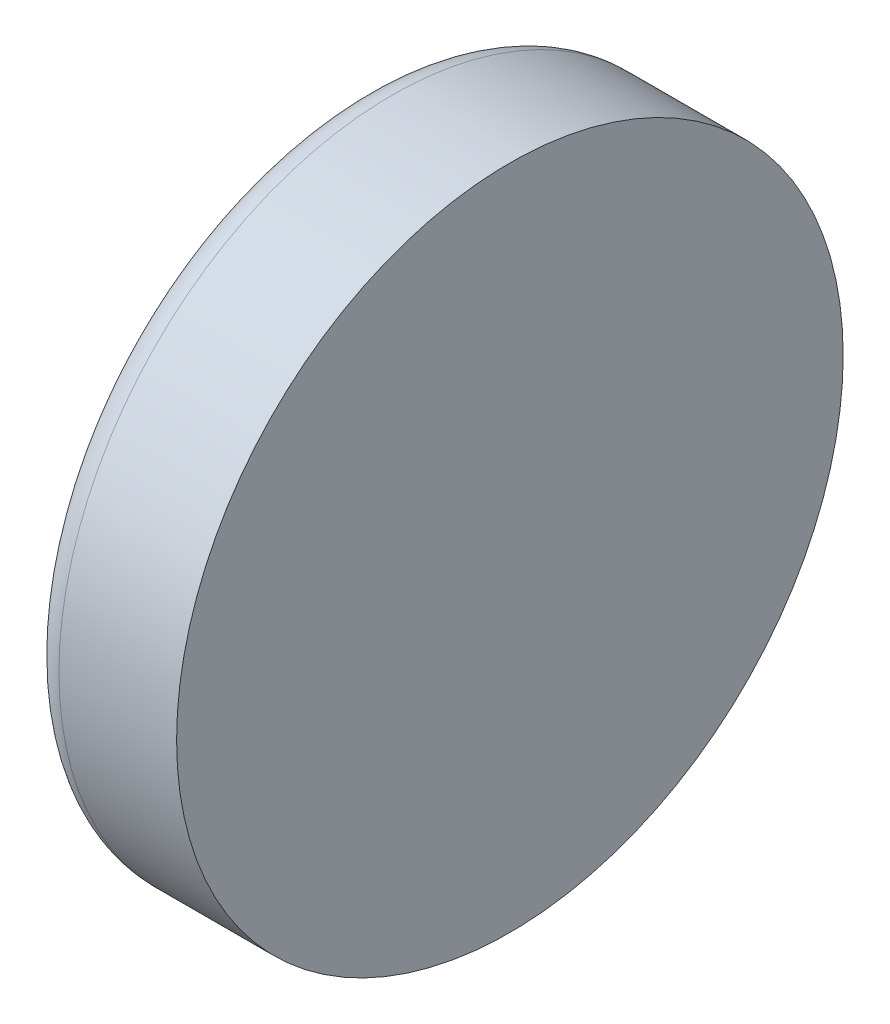
ISO-10303-21;
HEADER;
FILE_DESCRIPTION(('STEP AP214'),'2;1');
FILE_NAME('part.step','',(''),(''),'','','');
FILE_SCHEMA(('AUTOMOTIVE_DESIGN { 1 0 10303 214 1 1 1 1 }'));
ENDSEC;
DATA;
#1=APPLICATION_CONTEXT('core data for automotive mechanical design processes');
#2=APPLICATION_PROTOCOL_DEFINITION('international standard','automotive_design',2000,#1);
#3=PRODUCT_CONTEXT('',#1,'mechanical');
#4=PRODUCT('Part','Part','',(#3));
#5=PRODUCT_RELATED_PRODUCT_CATEGORY('part','',(#4));
#6=PRODUCT_DEFINITION_FORMATION('','',#4);
#7=PRODUCT_DEFINITION_CONTEXT('part definition',#1,'design');
#8=PRODUCT_DEFINITION('design','',#6,#7);
#9=PRODUCT_DEFINITION_SHAPE('','',#8);
#10=(LENGTH_UNIT() NAMED_UNIT(*) SI_UNIT(.MILLI.,.METRE.));
#11=(NAMED_UNIT(*) PLANE_ANGLE_UNIT() SI_UNIT($,.RADIAN.));
#12=(NAMED_UNIT(*) SI_UNIT($,.STERADIAN.) SOLID_ANGLE_UNIT());
#13=UNCERTAINTY_MEASURE_WITH_UNIT(LENGTH_MEASURE(1.E-05),#10,'distance_accuracy_value','');
#14=(GEOMETRIC_REPRESENTATION_CONTEXT(3) GLOBAL_UNCERTAINTY_ASSIGNED_CONTEXT((#13)) GLOBAL_UNIT_ASSIGNED_CONTEXT((#10,
#11,#12)) REPRESENTATION_CONTEXT('',''));
#15=CARTESIAN_POINT('',(0.,0.,0.));
#16=DIRECTION('',(0.,0.,1.));
#17=DIRECTION('',(1.,0.,0.));
#18=AXIS2_PLACEMENT_3D('',#15,#16,#17);
#19=CARTESIAN_POINT('',(0.5,0.,0.75));
#20=DIRECTION('',(1.,0.,0.));
#21=DIRECTION('',(0.,0.,-1.));
#22=AXIS2_PLACEMENT_3D('',#19,#20,#21);
#23=PLANE('',#22);
#24=CARTESIAN_POINT('',(0.5,0.,0.75));
#25=DIRECTION('',(-1.,0.,0.));
#26=DIRECTION('',(0.,0.,1.));
#27=AXIS2_PLACEMENT_3D('',#24,#25,#26);
#28=CIRCLE('',#27,0.620000007153);
#29=CARTESIAN_POINT('',(0.5,0.,1.370000007153));
#30=VERTEX_POINT('',#29);
#31=EDGE_CURVE('E19',#30,#30,#28,.F.);
#32=ORIENTED_EDGE('',*,*,#31,.F.);
#33=EDGE_LOOP('',(#32));
#34=FACE_BOUND('',#33,.T.);
#35=ADVANCED_FACE('F15',(#34),#23,.F.);
#36=CARTESIAN_POINT('',(0.56,0.,0.75));
#37=DIRECTION('',(-1.,0.,0.));
#38=DIRECTION('',(0.,0.,1.));
#39=AXIS2_PLACEMENT_3D('',#36,#37,#38);
#40=TOROIDAL_SURFACE('',#39,0.620000007153,0.06);
#41=ORIENTED_EDGE('',*,*,#31,.T.);
#42=EDGE_LOOP('',(#41));
#43=FACE_BOUND('',#42,.T.);
#44=CARTESIAN_POINT('',(0.56,0.,0.75));
#45=DIRECTION('',(1.,0.,0.));
#46=DIRECTION('',(0.,0.,-1.));
#47=AXIS2_PLACEMENT_3D('',#44,#45,#46);
#48=CIRCLE('',#47,0.680000007153);
#49=CARTESIAN_POINT('',(0.56,0.,0.069999992847));
#50=VERTEX_POINT('',#49);
#51=EDGE_CURVE('E23',#50,#50,#48,.T.);
#52=ORIENTED_EDGE('',*,*,#51,.F.);
#53=EDGE_LOOP('',(#52));
#54=FACE_BOUND('',#53,.T.);
#55=ADVANCED_FACE('F17',(#43,#54),#40,.T.);
#56=CARTESIAN_POINT('',(0.5,0.,0.75));
#57=DIRECTION('',(1.,0.,0.));
#58=DIRECTION('',(0.,0.,-1.));
#59=AXIS2_PLACEMENT_3D('',#56,#57,#58);
#60=CYLINDRICAL_SURFACE('',#59,0.680000007153);
#61=ORIENTED_EDGE('',*,*,#51,.T.);
#62=EDGE_LOOP('',(#61));
#63=FACE_BOUND('',#62,.T.);
#64=CARTESIAN_POINT('',(0.800000011921,0.,0.75));
#65=DIRECTION('',(1.,0.,0.));
#66=DIRECTION('',(0.,0.,-1.));
#67=AXIS2_PLACEMENT_3D('',#64,#65,#66);
#68=CIRCLE('',#67,0.680000007153);
#69=CARTESIAN_POINT('',(0.800000011921,0.,0.0699999928470001));
#70=VERTEX_POINT('',#69);
#71=EDGE_CURVE('E10',#70,#70,#68,.T.);
#72=ORIENTED_EDGE('',*,*,#71,.F.);
#73=EDGE_LOOP('',(#72));
#74=FACE_BOUND('',#73,.T.);
#75=ADVANCED_FACE('F40',(#63,#74),#60,.T.);
#76=CARTESIAN_POINT('',(0.800000011921,0.,0.75));
#77=DIRECTION('',(1.,0.,0.));
#78=DIRECTION('',(0.,0.,-1.));
#79=AXIS2_PLACEMENT_3D('',#76,#77,#78);
#80=PLANE('',#79);
#81=ORIENTED_EDGE('',*,*,#71,.T.);
#82=EDGE_LOOP('',(#81));
#83=FACE_BOUND('',#82,.T.);
#84=ADVANCED_FACE('F42',(#83),#80,.T.);
#85=CLOSED_SHELL('',(#35,#55,#75,#84));
#86=MANIFOLD_SOLID_BREP('B1',#85);
#87=ADVANCED_BREP_SHAPE_REPRESENTATION('',(#18,#86),#14);
#88=SHAPE_DEFINITION_REPRESENTATION(#9,#87);
ENDSEC;
END-ISO-10303-21;
